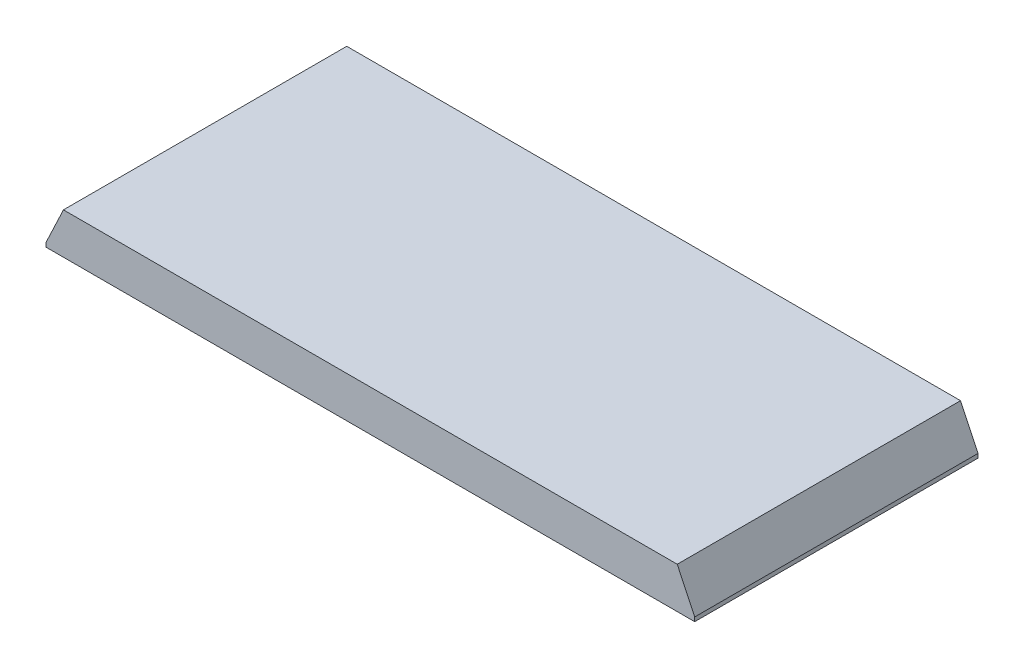
ISO-10303-21;
HEADER;
FILE_DESCRIPTION(('STEP AP214'),'2;1');
FILE_NAME('part.step','',(''),(''),'','','');
FILE_SCHEMA(('AUTOMOTIVE_DESIGN { 1 0 10303 214 1 1 1 1 }'));
ENDSEC;
DATA;
#1=APPLICATION_CONTEXT('core data for automotive mechanical design processes');
#2=APPLICATION_PROTOCOL_DEFINITION('international standard','automotive_design',2000,#1);
#3=PRODUCT_CONTEXT('',#1,'mechanical');
#4=PRODUCT('Part','Part','',(#3));
#5=PRODUCT_RELATED_PRODUCT_CATEGORY('part','',(#4));
#6=PRODUCT_DEFINITION_FORMATION('','',#4);
#7=PRODUCT_DEFINITION_CONTEXT('part definition',#1,'design');
#8=PRODUCT_DEFINITION('design','',#6,#7);
#9=PRODUCT_DEFINITION_SHAPE('','',#8);
#10=(LENGTH_UNIT() NAMED_UNIT(*) SI_UNIT(.MILLI.,.METRE.));
#11=(NAMED_UNIT(*) PLANE_ANGLE_UNIT() SI_UNIT($,.RADIAN.));
#12=(NAMED_UNIT(*) SI_UNIT($,.STERADIAN.) SOLID_ANGLE_UNIT());
#13=UNCERTAINTY_MEASURE_WITH_UNIT(LENGTH_MEASURE(1.E-05),#10,'distance_accuracy_value','');
#14=(GEOMETRIC_REPRESENTATION_CONTEXT(3) GLOBAL_UNCERTAINTY_ASSIGNED_CONTEXT((#13)) GLOBAL_UNIT_ASSIGNED_CONTEXT((#10,
#11,#12)) REPRESENTATION_CONTEXT('',''));
#15=CARTESIAN_POINT('',(0.,0.,0.));
#16=DIRECTION('',(0.,0.,1.));
#17=DIRECTION('',(1.,0.,0.));
#18=AXIS2_PLACEMENT_3D('',#15,#16,#17);
#19=CARTESIAN_POINT('',(-74.75,0.,69.));
#20=DIRECTION('',(0.904248646745991,-0.427006305407829,0.));
#21=DIRECTION('',(0.427006305407829,0.904248646745991,0.));
#22=AXIS2_PLACEMENT_3D('',#19,#20,#21);
#23=PLANE('',#22);
#24=DIRECTION('',(-0.427006305407829,-0.904248646745991,0.));
#25=VECTOR('',#24,1.);
#26=CARTESIAN_POINT('',(-74.75,0.,0.));
#27=LINE('',#26,#25);
#28=CARTESIAN_POINT('',(-74.75,0.,0.));
#29=VERTEX_POINT('',#28);
#30=CARTESIAN_POINT('',(-79.,-9.00000000000001,0.));
#31=VERTEX_POINT('',#30);
#32=EDGE_CURVE('E119',#29,#31,#27,.T.);
#33=ORIENTED_EDGE('',*,*,#32,.T.);
#34=DIRECTION('',(0.,0.,-1.));
#35=VECTOR('',#34,1.);
#36=CARTESIAN_POINT('',(-79.,-9.00000000000001,69.));
#37=LINE('',#36,#35);
#38=CARTESIAN_POINT('',(-79.,-9.00000000000001,69.));
#39=VERTEX_POINT('',#38);
#40=EDGE_CURVE('E11',#39,#31,#37,.T.);
#41=ORIENTED_EDGE('',*,*,#40,.F.);
#42=DIRECTION('',(-0.427006305407829,-0.904248646745991,0.));
#43=VECTOR('',#42,1.);
#44=CARTESIAN_POINT('',(-74.75,0.,69.));
#45=LINE('',#44,#43);
#46=CARTESIAN_POINT('',(-74.75,0.,69.));
#47=VERTEX_POINT('',#46);
#48=EDGE_CURVE('E129',#47,#39,#45,.T.);
#49=ORIENTED_EDGE('',*,*,#48,.F.);
#50=DIRECTION('',(0.,0.,-1.));
#51=VECTOR('',#50,1.);
#52=CARTESIAN_POINT('',(-74.75,0.,69.));
#53=LINE('',#52,#51);
#54=EDGE_CURVE('E115',#47,#29,#53,.T.);
#55=ORIENTED_EDGE('',*,*,#54,.T.);
#56=EDGE_LOOP('',(#33,#41,#49,#55));
#57=FACE_BOUND('',#56,.T.);
#58=ADVANCED_FACE('F35',(#57),#23,.F.);
#59=CARTESIAN_POINT('',(-79.,-9.00000000000001,69.));
#60=DIRECTION('',(1.,0.,0.));
#61=DIRECTION('',(0.,0.,-1.));
#62=AXIS2_PLACEMENT_3D('',#59,#60,#61);
#63=PLANE('',#62);
#64=DIRECTION('',(0.,-1.,0.));
#65=VECTOR('',#64,1.);
#66=CARTESIAN_POINT('',(-79.,-9.00000000000001,0.));
#67=LINE('',#66,#65);
#68=CARTESIAN_POINT('',(-79.,-10.,0.));
#69=VERTEX_POINT('',#68);
#70=EDGE_CURVE('E122',#31,#69,#67,.T.);
#71=ORIENTED_EDGE('',*,*,#70,.T.);
#72=DIRECTION('',(0.,0.,-1.));
#73=VECTOR('',#72,1.);
#74=CARTESIAN_POINT('',(-79.,-10.,69.));
#75=LINE('',#74,#73);
#76=CARTESIAN_POINT('',(-79.,-10.,69.));
#77=VERTEX_POINT('',#76);
#78=EDGE_CURVE('E43',#77,#69,#75,.T.);
#79=ORIENTED_EDGE('',*,*,#78,.F.);
#80=DIRECTION('',(0.,-1.,0.));
#81=VECTOR('',#80,1.);
#82=CARTESIAN_POINT('',(-79.,-9.00000000000001,69.));
#83=LINE('',#82,#81);
#84=EDGE_CURVE('E88',#39,#77,#83,.T.);
#85=ORIENTED_EDGE('',*,*,#84,.F.);
#86=ORIENTED_EDGE('',*,*,#40,.T.);
#87=EDGE_LOOP('',(#71,#79,#85,#86));
#88=FACE_BOUND('',#87,.T.);
#89=ADVANCED_FACE('F153',(#88),#63,.F.);
#90=CARTESIAN_POINT('',(-79.,-10.,69.));
#91=DIRECTION('',(0.,1.,0.));
#92=DIRECTION('',(0.,0.,1.));
#93=AXIS2_PLACEMENT_3D('',#90,#91,#92);
#94=PLANE('',#93);
#95=DIRECTION('',(1.,0.,0.));
#96=VECTOR('',#95,1.);
#97=CARTESIAN_POINT('',(-79.,-10.,0.));
#98=LINE('',#97,#96);
#99=CARTESIAN_POINT('',(79.,-10.,0.));
#100=VERTEX_POINT('',#99);
#101=EDGE_CURVE('E124',#69,#100,#98,.T.);
#102=ORIENTED_EDGE('',*,*,#101,.T.);
#103=DIRECTION('',(0.,0.,-1.));
#104=VECTOR('',#103,1.);
#105=CARTESIAN_POINT('',(79.,-10.,69.));
#106=LINE('',#105,#104);
#107=CARTESIAN_POINT('',(79.,-10.,69.));
#108=VERTEX_POINT('',#107);
#109=EDGE_CURVE('E110',#108,#100,#106,.T.);
#110=ORIENTED_EDGE('',*,*,#109,.F.);
#111=DIRECTION('',(1.,0.,0.));
#112=VECTOR('',#111,1.);
#113=CARTESIAN_POINT('',(-79.,-10.,69.));
#114=LINE('',#113,#112);
#115=EDGE_CURVE('E101',#77,#108,#114,.T.);
#116=ORIENTED_EDGE('',*,*,#115,.F.);
#117=ORIENTED_EDGE('',*,*,#78,.T.);
#118=EDGE_LOOP('',(#102,#110,#116,#117));
#119=FACE_BOUND('',#118,.T.);
#120=ADVANCED_FACE('F135',(#119),#94,.F.);
#121=CARTESIAN_POINT('',(79.,-9.00000000000001,69.));
#122=DIRECTION('',(-1.,0.,0.));
#123=DIRECTION('',(0.,0.,1.));
#124=AXIS2_PLACEMENT_3D('',#121,#122,#123);
#125=PLANE('',#124);
#126=DIRECTION('',(0.,1.,0.));
#127=VECTOR('',#126,1.);
#128=CARTESIAN_POINT('',(79.,-9.00000000000001,0.));
#129=LINE('',#128,#127);
#130=CARTESIAN_POINT('',(79.,-9.00000000000001,0.));
#131=VERTEX_POINT('',#130);
#132=EDGE_CURVE('E109',#100,#131,#129,.T.);
#133=ORIENTED_EDGE('',*,*,#132,.T.);
#134=DIRECTION('',(0.,0.,-1.));
#135=VECTOR('',#134,1.);
#136=CARTESIAN_POINT('',(79.,-9.00000000000001,69.));
#137=LINE('',#136,#135);
#138=CARTESIAN_POINT('',(79.,-9.00000000000001,69.));
#139=VERTEX_POINT('',#138);
#140=EDGE_CURVE('E106',#139,#131,#137,.T.);
#141=ORIENTED_EDGE('',*,*,#140,.F.);
#142=DIRECTION('',(0.,1.,0.));
#143=VECTOR('',#142,1.);
#144=CARTESIAN_POINT('',(79.,-9.00000000000001,69.));
#145=LINE('',#144,#143);
#146=EDGE_CURVE('E95',#108,#139,#145,.T.);
#147=ORIENTED_EDGE('',*,*,#146,.F.);
#148=ORIENTED_EDGE('',*,*,#109,.T.);
#149=EDGE_LOOP('',(#133,#141,#147,#148));
#150=FACE_BOUND('',#149,.T.);
#151=ADVANCED_FACE('F107',(#150),#125,.F.);
#152=CARTESIAN_POINT('',(74.75,0.,69.));
#153=DIRECTION('',(-0.904248646745991,-0.427006305407829,0.));
#154=DIRECTION('',(0.427006305407829,-0.904248646745991,0.));
#155=AXIS2_PLACEMENT_3D('',#152,#153,#154);
#156=PLANE('',#155);
#157=DIRECTION('',(-0.427006305407829,0.904248646745991,0.));
#158=VECTOR('',#157,1.);
#159=CARTESIAN_POINT('',(74.75,0.,0.));
#160=LINE('',#159,#158);
#161=CARTESIAN_POINT('',(74.75,0.,0.));
#162=VERTEX_POINT('',#161);
#163=EDGE_CURVE('E74',#131,#162,#160,.T.);
#164=ORIENTED_EDGE('',*,*,#163,.T.);
#165=DIRECTION('',(0.,0.,-1.));
#166=VECTOR('',#165,1.);
#167=CARTESIAN_POINT('',(74.75,0.,69.));
#168=LINE('',#167,#166);
#169=CARTESIAN_POINT('',(74.75,0.,69.));
#170=VERTEX_POINT('',#169);
#171=EDGE_CURVE('E111',#170,#162,#168,.T.);
#172=ORIENTED_EDGE('',*,*,#171,.F.);
#173=DIRECTION('',(-0.427006305407829,0.904248646745991,0.));
#174=VECTOR('',#173,1.);
#175=CARTESIAN_POINT('',(74.75,0.,69.));
#176=LINE('',#175,#174);
#177=EDGE_CURVE('E99',#139,#170,#176,.T.);
#178=ORIENTED_EDGE('',*,*,#177,.F.);
#179=ORIENTED_EDGE('',*,*,#140,.T.);
#180=EDGE_LOOP('',(#164,#172,#178,#179));
#181=FACE_BOUND('',#180,.T.);
#182=ADVANCED_FACE('F113',(#181),#156,.F.);
#183=CARTESIAN_POINT('',(74.75,0.,69.));
#184=DIRECTION('',(0.,-1.,0.));
#185=DIRECTION('',(0.,0.,-1.));
#186=AXIS2_PLACEMENT_3D('',#183,#184,#185);
#187=PLANE('',#186);
#188=DIRECTION('',(-1.,0.,0.));
#189=VECTOR('',#188,1.);
#190=CARTESIAN_POINT('',(74.75,0.,0.));
#191=LINE('',#190,#189);
#192=EDGE_CURVE('E80',#162,#29,#191,.T.);
#193=ORIENTED_EDGE('',*,*,#192,.T.);
#194=ORIENTED_EDGE('',*,*,#54,.F.);
#195=DIRECTION('',(-1.,0.,0.));
#196=VECTOR('',#195,1.);
#197=CARTESIAN_POINT('',(74.75,0.,69.));
#198=LINE('',#197,#196);
#199=EDGE_CURVE('E51',#170,#47,#198,.T.);
#200=ORIENTED_EDGE('',*,*,#199,.F.);
#201=ORIENTED_EDGE('',*,*,#171,.T.);
#202=EDGE_LOOP('',(#193,#194,#200,#201));
#203=FACE_BOUND('',#202,.T.);
#204=ADVANCED_FACE('F142',(#203),#187,.F.);
#205=CARTESIAN_POINT('',(0.,0.,69.));
#206=DIRECTION('',(0.,0.,1.));
#207=DIRECTION('',(1.,0.,0.));
#208=AXIS2_PLACEMENT_3D('',#205,#206,#207);
#209=PLANE('',#208);
#210=ORIENTED_EDGE('',*,*,#48,.T.);
#211=ORIENTED_EDGE('',*,*,#84,.T.);
#212=ORIENTED_EDGE('',*,*,#115,.T.);
#213=ORIENTED_EDGE('',*,*,#146,.T.);
#214=ORIENTED_EDGE('',*,*,#177,.T.);
#215=ORIENTED_EDGE('',*,*,#199,.T.);
#216=EDGE_LOOP('',(#210,#211,#212,#213,#214,#215));
#217=FACE_BOUND('',#216,.T.);
#218=ADVANCED_FACE('F97',(#217),#209,.T.);
#219=CARTESIAN_POINT('',(0.,0.,0.));
#220=DIRECTION('',(0.,0.,1.));
#221=DIRECTION('',(1.,0.,0.));
#222=AXIS2_PLACEMENT_3D('',#219,#220,#221);
#223=PLANE('',#222);
#224=ORIENTED_EDGE('',*,*,#32,.F.);
#225=ORIENTED_EDGE('',*,*,#192,.F.);
#226=ORIENTED_EDGE('',*,*,#163,.F.);
#227=ORIENTED_EDGE('',*,*,#132,.F.);
#228=ORIENTED_EDGE('',*,*,#101,.F.);
#229=ORIENTED_EDGE('',*,*,#70,.F.);
#230=EDGE_LOOP('',(#224,#225,#226,#227,#228,#229));
#231=FACE_BOUND('',#230,.T.);
#232=ADVANCED_FACE('F138',(#231),#223,.F.);
#233=CLOSED_SHELL('',(#58,#89,#120,#151,#182,#204,#218,#232));
#234=MANIFOLD_SOLID_BREP('B2',#233);
#235=ADVANCED_BREP_SHAPE_REPRESENTATION('',(#18,#234),#14);
#236=SHAPE_DEFINITION_REPRESENTATION(#9,#235);
ENDSEC;
END-ISO-10303-21;
